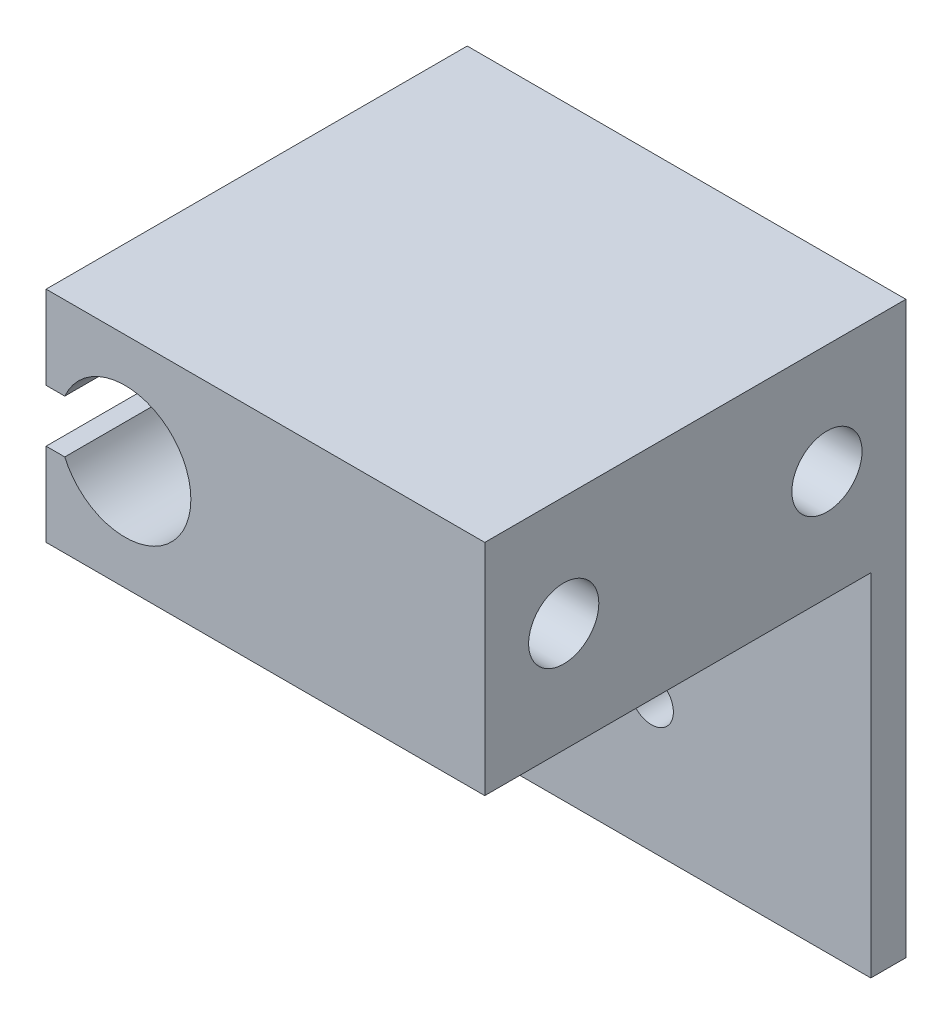
ISO-10303-21;
HEADER;
FILE_DESCRIPTION(('STEP AP214'),'2;1');
FILE_NAME('part.step','',(''),(''),'','','');
FILE_SCHEMA(('AUTOMOTIVE_DESIGN { 1 0 10303 214 1 1 1 1 }'));
ENDSEC;
DATA;
#1=APPLICATION_CONTEXT('core data for automotive mechanical design processes');
#2=APPLICATION_PROTOCOL_DEFINITION('international standard','automotive_design',2000,#1);
#3=PRODUCT_CONTEXT('',#1,'mechanical');
#4=PRODUCT('Part','Part','',(#3));
#5=PRODUCT_RELATED_PRODUCT_CATEGORY('part','',(#4));
#6=PRODUCT_DEFINITION_FORMATION('','',#4);
#7=PRODUCT_DEFINITION_CONTEXT('part definition',#1,'design');
#8=PRODUCT_DEFINITION('design','',#6,#7);
#9=PRODUCT_DEFINITION_SHAPE('','',#8);
#10=(LENGTH_UNIT() NAMED_UNIT(*) SI_UNIT(.MILLI.,.METRE.));
#11=(NAMED_UNIT(*) PLANE_ANGLE_UNIT() SI_UNIT($,.RADIAN.));
#12=(NAMED_UNIT(*) SI_UNIT($,.STERADIAN.) SOLID_ANGLE_UNIT());
#13=UNCERTAINTY_MEASURE_WITH_UNIT(LENGTH_MEASURE(1.E-05),#10,'distance_accuracy_value','');
#14=(GEOMETRIC_REPRESENTATION_CONTEXT(3) GLOBAL_UNCERTAINTY_ASSIGNED_CONTEXT((#13)) GLOBAL_UNIT_ASSIGNED_CONTEXT((#10,
#11,#12)) REPRESENTATION_CONTEXT('',''));
#15=CARTESIAN_POINT('',(0.,0.,0.));
#16=DIRECTION('',(0.,0.,1.));
#17=DIRECTION('',(1.,0.,0.));
#18=AXIS2_PLACEMENT_3D('',#15,#16,#17);
#19=CARTESIAN_POINT('',(25.,-12.5,24.));
#20=DIRECTION('',(-1.,0.,0.));
#21=DIRECTION('',(0.,0.,1.));
#22=AXIS2_PLACEMENT_3D('',#19,#20,#21);
#23=PLANE('',#22);
#24=CARTESIAN_POINT('',(25.,0.,15.));
#25=DIRECTION('',(1.,0.,0.));
#26=DIRECTION('',(0.,0.,-1.));
#27=AXIS2_PLACEMENT_3D('',#24,#25,#26);
#28=CIRCLE('',#27,4.);
#29=CARTESIAN_POINT('',(25.,0.,11.));
#30=VERTEX_POINT('',#29);
#31=EDGE_CURVE('E190',#30,#30,#28,.T.);
#32=ORIENTED_EDGE('',*,*,#31,.F.);
#33=EDGE_LOOP('',(#32));
#34=FACE_BOUND('',#33,.T.);
#35=CARTESIAN_POINT('',(25.,0.,-15.));
#36=DIRECTION('',(1.,0.,0.));
#37=DIRECTION('',(0.,0.,-1.));
#38=AXIS2_PLACEMENT_3D('',#35,#36,#37);
#39=CIRCLE('',#38,4.);
#40=CARTESIAN_POINT('',(25.,0.,-19.));
#41=VERTEX_POINT('',#40);
#42=EDGE_CURVE('E183',#41,#41,#39,.T.);
#43=ORIENTED_EDGE('',*,*,#42,.F.);
#44=EDGE_LOOP('',(#43));
#45=FACE_BOUND('',#44,.T.);
#46=DIRECTION('',(0.,1.,0.));
#47=VECTOR('',#46,1.);
#48=CARTESIAN_POINT('',(25.,-12.5,-24.));
#49=LINE('',#48,#47);
#50=CARTESIAN_POINT('',(25.,-52.5,-24.));
#51=VERTEX_POINT('',#50);
#52=CARTESIAN_POINT('',(25.,12.5,-24.));
#53=VERTEX_POINT('',#52);
#54=EDGE_CURVE('E133',#51,#53,#49,.T.);
#55=ORIENTED_EDGE('',*,*,#54,.T.);
#56=DIRECTION('',(0.,0.,-1.));
#57=VECTOR('',#56,1.);
#58=CARTESIAN_POINT('',(25.,12.5,24.));
#59=LINE('',#58,#57);
#60=CARTESIAN_POINT('',(25.,12.5,24.));
#61=VERTEX_POINT('',#60);
#62=EDGE_CURVE('E11',#61,#53,#59,.T.);
#63=ORIENTED_EDGE('',*,*,#62,.F.);
#64=DIRECTION('',(0.,1.,0.));
#65=VECTOR('',#64,1.);
#66=CARTESIAN_POINT('',(25.,-12.5,24.));
#67=LINE('',#66,#65);
#68=CARTESIAN_POINT('',(25.,-12.5,24.));
#69=VERTEX_POINT('',#68);
#70=EDGE_CURVE('E148',#69,#61,#67,.T.);
#71=ORIENTED_EDGE('',*,*,#70,.F.);
#72=DIRECTION('',(0.,0.,-1.));
#73=VECTOR('',#72,1.);
#74=CARTESIAN_POINT('',(25.,-12.5,24.));
#75=LINE('',#74,#73);
#76=CARTESIAN_POINT('',(25.,-12.5,-20.));
#77=VERTEX_POINT('',#76);
#78=EDGE_CURVE('E129',#69,#77,#75,.T.);
#79=ORIENTED_EDGE('',*,*,#78,.T.);
#80=DIRECTION('',(0.,-1.,0.));
#81=VECTOR('',#80,1.);
#82=CARTESIAN_POINT('',(25.,-12.5,-20.));
#83=LINE('',#82,#81);
#84=CARTESIAN_POINT('',(25.,-52.5,-20.));
#85=VERTEX_POINT('',#84);
#86=EDGE_CURVE('E47',#77,#85,#83,.T.);
#87=ORIENTED_EDGE('',*,*,#86,.T.);
#88=DIRECTION('',(0.,0.,-1.));
#89=VECTOR('',#88,1.);
#90=CARTESIAN_POINT('',(25.,-52.5,-20.));
#91=LINE('',#90,#89);
#92=EDGE_CURVE('E195',#85,#51,#91,.T.);
#93=ORIENTED_EDGE('',*,*,#92,.T.);
#94=EDGE_LOOP('',(#55,#63,#71,#79,#87,#93));
#95=FACE_BOUND('',#94,.T.);
#96=ADVANCED_FACE('F33',(#34,#45,#95),#23,.F.);
#97=CARTESIAN_POINT('',(-25.,12.5,24.));
#98=DIRECTION('',(0.,-1.,0.));
#99=DIRECTION('',(1.,0.,0.));
#100=AXIS2_PLACEMENT_3D('',#97,#98,#99);
#101=PLANE('',#100);
#102=DIRECTION('',(-1.,0.,0.));
#103=VECTOR('',#102,1.);
#104=CARTESIAN_POINT('',(-25.,12.5,-24.));
#105=LINE('',#104,#103);
#106=CARTESIAN_POINT('',(-25.,12.5,-24.));
#107=VERTEX_POINT('',#106);
#108=EDGE_CURVE('E136',#53,#107,#105,.T.);
#109=ORIENTED_EDGE('',*,*,#108,.T.);
#110=DIRECTION('',(0.,0.,-1.));
#111=VECTOR('',#110,1.);
#112=CARTESIAN_POINT('',(-25.,12.5,24.));
#113=LINE('',#112,#111);
#114=CARTESIAN_POINT('',(-25.,12.5,24.));
#115=VERTEX_POINT('',#114);
#116=EDGE_CURVE('E40',#115,#107,#113,.T.);
#117=ORIENTED_EDGE('',*,*,#116,.F.);
#118=DIRECTION('',(-1.,0.,0.));
#119=VECTOR('',#118,1.);
#120=CARTESIAN_POINT('',(-25.,12.5,24.));
#121=LINE('',#120,#119);
#122=EDGE_CURVE('E92',#61,#115,#121,.T.);
#123=ORIENTED_EDGE('',*,*,#122,.F.);
#124=ORIENTED_EDGE('',*,*,#62,.T.);
#125=EDGE_LOOP('',(#109,#117,#123,#124));
#126=FACE_BOUND('',#125,.T.);
#127=ADVANCED_FACE('F239',(#126),#101,.F.);
#128=CARTESIAN_POINT('',(-25.,3.,24.));
#129=DIRECTION('',(1.,0.,0.));
#130=DIRECTION('',(0.,0.,-1.));
#131=AXIS2_PLACEMENT_3D('',#128,#129,#130);
#132=PLANE('',#131);
#133=DIRECTION('',(0.,-1.,0.));
#134=VECTOR('',#133,1.);
#135=CARTESIAN_POINT('',(-25.,3.,-24.));
#136=LINE('',#135,#134);
#137=CARTESIAN_POINT('',(-25.,3.,-24.));
#138=VERTEX_POINT('',#137);
#139=EDGE_CURVE('E139',#107,#138,#136,.T.);
#140=ORIENTED_EDGE('',*,*,#139,.T.);
#141=DIRECTION('',(0.,0.,-1.));
#142=VECTOR('',#141,1.);
#143=CARTESIAN_POINT('',(-25.,3.,24.));
#144=LINE('',#143,#142);
#145=CARTESIAN_POINT('',(-25.,3.,24.));
#146=VERTEX_POINT('',#145);
#147=EDGE_CURVE('E156',#146,#138,#144,.T.);
#148=ORIENTED_EDGE('',*,*,#147,.F.);
#149=DIRECTION('',(0.,-1.,0.));
#150=VECTOR('',#149,1.);
#151=CARTESIAN_POINT('',(-25.,3.,24.));
#152=LINE('',#151,#150);
#153=EDGE_CURVE('E164',#115,#146,#152,.T.);
#154=ORIENTED_EDGE('',*,*,#153,.F.);
#155=ORIENTED_EDGE('',*,*,#116,.T.);
#156=EDGE_LOOP('',(#140,#148,#154,#155));
#157=FACE_BOUND('',#156,.T.);
#158=ADVANCED_FACE('F162',(#157),#132,.F.);
#159=CARTESIAN_POINT('',(-22.8738635424338,3.,24.));
#160=DIRECTION('',(0.,1.,0.));
#161=DIRECTION('',(0.,0.,1.));
#162=AXIS2_PLACEMENT_3D('',#159,#160,#161);
#163=PLANE('',#162);
#164=DIRECTION('',(1.,0.,0.));
#165=VECTOR('',#164,1.);
#166=CARTESIAN_POINT('',(-22.8738635424338,3.,-24.));
#167=LINE('',#166,#165);
#168=CARTESIAN_POINT('',(-22.8738635424338,3.,-24.));
#169=VERTEX_POINT('',#168);
#170=EDGE_CURVE('E141',#138,#169,#167,.T.);
#171=ORIENTED_EDGE('',*,*,#170,.T.);
#172=DIRECTION('',(0.,0.,-1.));
#173=VECTOR('',#172,1.);
#174=CARTESIAN_POINT('',(-22.8738635424338,3.,24.));
#175=LINE('',#174,#173);
#176=CARTESIAN_POINT('',(-22.8738635424338,3.,24.));
#177=VERTEX_POINT('',#176);
#178=EDGE_CURVE('E153',#177,#169,#175,.T.);
#179=ORIENTED_EDGE('',*,*,#178,.F.);
#180=DIRECTION('',(1.,0.,0.));
#181=VECTOR('',#180,1.);
#182=CARTESIAN_POINT('',(-22.8738635424338,3.,24.));
#183=LINE('',#182,#181);
#184=EDGE_CURVE('E177',#146,#177,#183,.T.);
#185=ORIENTED_EDGE('',*,*,#184,.F.);
#186=ORIENTED_EDGE('',*,*,#147,.T.);
#187=EDGE_LOOP('',(#171,#179,#185,#186));
#188=FACE_BOUND('',#187,.T.);
#189=ADVANCED_FACE('F173',(#188),#163,.F.);
#190=CARTESIAN_POINT('',(-16.,0.,24.));
#191=DIRECTION('',(0.,0.,-1.));
#192=DIRECTION('',(-1.,0.,0.));
#193=AXIS2_PLACEMENT_3D('',#190,#191,#192);
#194=CYLINDRICAL_SURFACE('',#193,7.5);
#195=CARTESIAN_POINT('',(-16.,0.,-24.));
#196=DIRECTION('',(0.,0.,-1.));
#197=DIRECTION('',(1.,0.,0.));
#198=AXIS2_PLACEMENT_3D('',#195,#196,#197);
#199=CIRCLE('',#198,7.5);
#200=CARTESIAN_POINT('',(-22.8738635424338,-3.,-24.));
#201=VERTEX_POINT('',#200);
#202=EDGE_CURVE('E143',#169,#201,#199,.T.);
#203=ORIENTED_EDGE('',*,*,#202,.T.);
#204=DIRECTION('',(0.,0.,-1.));
#205=VECTOR('',#204,1.);
#206=CARTESIAN_POINT('',(-22.8738635424338,-3.,24.));
#207=LINE('',#206,#205);
#208=CARTESIAN_POINT('',(-22.8738635424338,-3.,24.));
#209=VERTEX_POINT('',#208);
#210=EDGE_CURVE('E122',#209,#201,#207,.T.);
#211=ORIENTED_EDGE('',*,*,#210,.F.);
#212=CARTESIAN_POINT('',(-16.,0.,24.));
#213=DIRECTION('',(0.,0.,-1.));
#214=DIRECTION('',(1.,0.,0.));
#215=AXIS2_PLACEMENT_3D('',#212,#213,#214);
#216=CIRCLE('',#215,7.5);
#217=EDGE_CURVE('E114',#177,#209,#216,.T.);
#218=ORIENTED_EDGE('',*,*,#217,.F.);
#219=ORIENTED_EDGE('',*,*,#178,.T.);
#220=EDGE_LOOP('',(#203,#211,#218,#219));
#221=FACE_BOUND('',#220,.T.);
#222=ADVANCED_FACE('F176',(#221),#194,.F.);
#223=CARTESIAN_POINT('',(-25.,-3.,24.));
#224=DIRECTION('',(0.,-1.,0.));
#225=DIRECTION('',(0.,0.,-1.));
#226=AXIS2_PLACEMENT_3D('',#223,#224,#225);
#227=PLANE('',#226);
#228=DIRECTION('',(-1.,0.,0.));
#229=VECTOR('',#228,1.);
#230=CARTESIAN_POINT('',(-25.,-3.,-24.));
#231=LINE('',#230,#229);
#232=CARTESIAN_POINT('',(-25.,-3.,-24.));
#233=VERTEX_POINT('',#232);
#234=EDGE_CURVE('E84',#201,#233,#231,.T.);
#235=ORIENTED_EDGE('',*,*,#234,.T.);
#236=DIRECTION('',(0.,0.,-1.));
#237=VECTOR('',#236,1.);
#238=CARTESIAN_POINT('',(-25.,-3.,24.));
#239=LINE('',#238,#237);
#240=CARTESIAN_POINT('',(-25.,-3.,24.));
#241=VERTEX_POINT('',#240);
#242=EDGE_CURVE('E117',#241,#233,#239,.T.);
#243=ORIENTED_EDGE('',*,*,#242,.F.);
#244=DIRECTION('',(-1.,0.,0.));
#245=VECTOR('',#244,1.);
#246=CARTESIAN_POINT('',(-25.,-3.,24.));
#247=LINE('',#246,#245);
#248=EDGE_CURVE('E108',#209,#241,#247,.T.);
#249=ORIENTED_EDGE('',*,*,#248,.F.);
#250=ORIENTED_EDGE('',*,*,#210,.T.);
#251=EDGE_LOOP('',(#235,#243,#249,#250));
#252=FACE_BOUND('',#251,.T.);
#253=ADVANCED_FACE('F118',(#252),#227,.F.);
#254=CARTESIAN_POINT('',(-25.,-12.5,24.));
#255=DIRECTION('',(1.,0.,0.));
#256=DIRECTION('',(0.,0.,-1.));
#257=AXIS2_PLACEMENT_3D('',#254,#255,#256);
#258=PLANE('',#257);
#259=DIRECTION('',(0.,-1.,0.));
#260=VECTOR('',#259,1.);
#261=CARTESIAN_POINT('',(-25.,-12.5,-24.));
#262=LINE('',#261,#260);
#263=CARTESIAN_POINT('',(-25.,-52.5,-24.));
#264=VERTEX_POINT('',#263);
#265=EDGE_CURVE('E146',#233,#264,#262,.T.);
#266=ORIENTED_EDGE('',*,*,#265,.T.);
#267=DIRECTION('',(0.,0.,-1.));
#268=VECTOR('',#267,1.);
#269=CARTESIAN_POINT('',(-25.,-52.5,-20.));
#270=LINE('',#269,#268);
#271=CARTESIAN_POINT('',(-25.,-52.5,-20.));
#272=VERTEX_POINT('',#271);
#273=EDGE_CURVE('E187',#272,#264,#270,.T.);
#274=ORIENTED_EDGE('',*,*,#273,.F.);
#275=DIRECTION('',(0.,1.,0.));
#276=VECTOR('',#275,1.);
#277=CARTESIAN_POINT('',(-25.,-12.5,-20.));
#278=LINE('',#277,#276);
#279=CARTESIAN_POINT('',(-25.,-12.5,-20.));
#280=VERTEX_POINT('',#279);
#281=EDGE_CURVE('E206',#272,#280,#278,.T.);
#282=ORIENTED_EDGE('',*,*,#281,.T.);
#283=DIRECTION('',(0.,0.,-1.));
#284=VECTOR('',#283,1.);
#285=CARTESIAN_POINT('',(-25.,-12.5,24.));
#286=LINE('',#285,#284);
#287=CARTESIAN_POINT('',(-25.,-12.5,24.));
#288=VERTEX_POINT('',#287);
#289=EDGE_CURVE('E123',#288,#280,#286,.T.);
#290=ORIENTED_EDGE('',*,*,#289,.F.);
#291=DIRECTION('',(0.,-1.,0.));
#292=VECTOR('',#291,1.);
#293=CARTESIAN_POINT('',(-25.,-12.5,24.));
#294=LINE('',#293,#292);
#295=EDGE_CURVE('E111',#241,#288,#294,.T.);
#296=ORIENTED_EDGE('',*,*,#295,.F.);
#297=ORIENTED_EDGE('',*,*,#242,.T.);
#298=EDGE_LOOP('',(#266,#274,#282,#290,#296,#297));
#299=FACE_BOUND('',#298,.T.);
#300=ADVANCED_FACE('F125',(#299),#258,.F.);
#301=CARTESIAN_POINT('',(-25.,-12.5,24.));
#302=DIRECTION('',(0.,1.,0.));
#303=DIRECTION('',(0.,0.,1.));
#304=AXIS2_PLACEMENT_3D('',#301,#302,#303);
#305=PLANE('',#304);
#306=ORIENTED_EDGE('',*,*,#289,.T.);
#307=DIRECTION('',(1.,0.,0.));
#308=VECTOR('',#307,1.);
#309=CARTESIAN_POINT('',(25.,-12.5,-20.));
#310=LINE('',#309,#308);
#311=EDGE_CURVE('E198',#280,#77,#310,.T.);
#312=ORIENTED_EDGE('',*,*,#311,.T.);
#313=ORIENTED_EDGE('',*,*,#78,.F.);
#314=DIRECTION('',(1.,0.,0.));
#315=VECTOR('',#314,1.);
#316=CARTESIAN_POINT('',(-25.,-12.5,24.));
#317=LINE('',#316,#315);
#318=EDGE_CURVE('E56',#288,#69,#317,.T.);
#319=ORIENTED_EDGE('',*,*,#318,.F.);
#320=EDGE_LOOP('',(#306,#312,#313,#319));
#321=FACE_BOUND('',#320,.T.);
#322=ADVANCED_FACE('F235',(#321),#305,.F.);
#323=CARTESIAN_POINT('',(-16.,0.,24.));
#324=DIRECTION('',(0.,0.,1.));
#325=DIRECTION('',(1.,0.,0.));
#326=AXIS2_PLACEMENT_3D('',#323,#324,#325);
#327=PLANE('',#326);
#328=ORIENTED_EDGE('',*,*,#70,.T.);
#329=ORIENTED_EDGE('',*,*,#122,.T.);
#330=ORIENTED_EDGE('',*,*,#153,.T.);
#331=ORIENTED_EDGE('',*,*,#184,.T.);
#332=ORIENTED_EDGE('',*,*,#217,.T.);
#333=ORIENTED_EDGE('',*,*,#248,.T.);
#334=ORIENTED_EDGE('',*,*,#295,.T.);
#335=ORIENTED_EDGE('',*,*,#318,.T.);
#336=EDGE_LOOP('',(#328,#329,#330,#331,#332,#333,#334,#335));
#337=FACE_BOUND('',#336,.T.);
#338=ADVANCED_FACE('F109',(#337),#327,.T.);
#339=CARTESIAN_POINT('',(-16.,0.,-24.));
#340=DIRECTION('',(0.,0.,1.));
#341=DIRECTION('',(1.,0.,0.));
#342=AXIS2_PLACEMENT_3D('',#339,#340,#341);
#343=PLANE('',#342);
#344=ORIENTED_EDGE('',*,*,#54,.F.);
#345=DIRECTION('',(-1.,0.,0.));
#346=VECTOR('',#345,1.);
#347=CARTESIAN_POINT('',(25.,-52.5,-24.));
#348=LINE('',#347,#346);
#349=EDGE_CURVE('E201',#51,#264,#348,.T.);
#350=ORIENTED_EDGE('',*,*,#349,.T.);
#351=ORIENTED_EDGE('',*,*,#265,.F.);
#352=ORIENTED_EDGE('',*,*,#234,.F.);
#353=ORIENTED_EDGE('',*,*,#202,.F.);
#354=ORIENTED_EDGE('',*,*,#170,.F.);
#355=ORIENTED_EDGE('',*,*,#139,.F.);
#356=ORIENTED_EDGE('',*,*,#108,.F.);
#357=EDGE_LOOP('',(#344,#350,#351,#352,#353,#354,#355,#356));
#358=FACE_BOUND('',#357,.T.);
#359=CARTESIAN_POINT('',(0.,-37.5,-24.));
#360=DIRECTION('',(0.,0.,-1.));
#361=DIRECTION('',(-1.,0.,0.));
#362=AXIS2_PLACEMENT_3D('',#359,#360,#361);
#363=CIRCLE('',#362,2.5);
#364=CARTESIAN_POINT('',(-2.5,-37.5,-24.));
#365=VERTEX_POINT('',#364);
#366=EDGE_CURVE('E212',#365,#365,#363,.T.);
#367=ORIENTED_EDGE('',*,*,#366,.F.);
#368=EDGE_LOOP('',(#367));
#369=FACE_BOUND('',#368,.T.);
#370=ADVANCED_FACE('F168',(#358,#369),#343,.F.);
#371=CARTESIAN_POINT('',(-5.,0.,-15.));
#372=DIRECTION('',(1.,0.,0.));
#373=DIRECTION('',(0.,0.,-1.));
#374=AXIS2_PLACEMENT_3D('',#371,#372,#373);
#375=CYLINDRICAL_SURFACE('',#374,4.);
#376=CARTESIAN_POINT('',(-5.,0.,-15.));
#377=DIRECTION('',(1.,0.,0.));
#378=DIRECTION('',(0.,0.,-1.));
#379=AXIS2_PLACEMENT_3D('',#376,#377,#378);
#380=CIRCLE('',#379,4.);
#381=CARTESIAN_POINT('',(-5.,0.,-19.));
#382=VERTEX_POINT('',#381);
#383=EDGE_CURVE('E186',#382,#382,#380,.T.);
#384=ORIENTED_EDGE('',*,*,#383,.F.);
#385=EDGE_LOOP('',(#384));
#386=FACE_BOUND('',#385,.T.);
#387=ORIENTED_EDGE('',*,*,#42,.T.);
#388=EDGE_LOOP('',(#387));
#389=FACE_BOUND('',#388,.T.);
#390=ADVANCED_FACE('F226',(#386,#389),#375,.F.);
#391=CARTESIAN_POINT('',(-5.,0.,-15.));
#392=DIRECTION('',(1.,0.,0.));
#393=DIRECTION('',(0.,0.,-1.));
#394=AXIS2_PLACEMENT_3D('',#391,#392,#393);
#395=PLANE('',#394);
#396=ORIENTED_EDGE('',*,*,#383,.T.);
#397=EDGE_LOOP('',(#396));
#398=FACE_BOUND('',#397,.T.);
#399=ADVANCED_FACE('F232',(#398),#395,.T.);
#400=CARTESIAN_POINT('',(-5.,0.,15.));
#401=DIRECTION('',(1.,0.,0.));
#402=DIRECTION('',(0.,0.,-1.));
#403=AXIS2_PLACEMENT_3D('',#400,#401,#402);
#404=CYLINDRICAL_SURFACE('',#403,4.);
#405=CARTESIAN_POINT('',(-5.,0.,15.));
#406=DIRECTION('',(1.,0.,0.));
#407=DIRECTION('',(0.,0.,-1.));
#408=AXIS2_PLACEMENT_3D('',#405,#406,#407);
#409=CIRCLE('',#408,4.);
#410=CARTESIAN_POINT('',(-5.,0.,11.));
#411=VERTEX_POINT('',#410);
#412=EDGE_CURVE('E137',#411,#411,#409,.T.);
#413=ORIENTED_EDGE('',*,*,#412,.F.);
#414=EDGE_LOOP('',(#413));
#415=FACE_BOUND('',#414,.T.);
#416=ORIENTED_EDGE('',*,*,#31,.T.);
#417=EDGE_LOOP('',(#416));
#418=FACE_BOUND('',#417,.T.);
#419=ADVANCED_FACE('F341',(#415,#418),#404,.F.);
#420=CARTESIAN_POINT('',(-5.,0.,15.));
#421=DIRECTION('',(1.,0.,0.));
#422=DIRECTION('',(0.,0.,-1.));
#423=AXIS2_PLACEMENT_3D('',#420,#421,#422);
#424=PLANE('',#423);
#425=ORIENTED_EDGE('',*,*,#412,.T.);
#426=EDGE_LOOP('',(#425));
#427=FACE_BOUND('',#426,.T.);
#428=ADVANCED_FACE('F320',(#427),#424,.T.);
#429=CARTESIAN_POINT('',(25.,-52.5,-20.));
#430=DIRECTION('',(0.,-1.,0.));
#431=DIRECTION('',(0.,0.,-1.));
#432=AXIS2_PLACEMENT_3D('',#429,#430,#431);
#433=PLANE('',#432);
#434=ORIENTED_EDGE('',*,*,#349,.F.);
#435=ORIENTED_EDGE('',*,*,#92,.F.);
#436=DIRECTION('',(-1.,0.,0.));
#437=VECTOR('',#436,1.);
#438=CARTESIAN_POINT('',(25.,-52.5,-20.));
#439=LINE('',#438,#437);
#440=EDGE_CURVE('E208',#85,#272,#439,.T.);
#441=ORIENTED_EDGE('',*,*,#440,.T.);
#442=ORIENTED_EDGE('',*,*,#273,.T.);
#443=EDGE_LOOP('',(#434,#435,#441,#442));
#444=FACE_BOUND('',#443,.T.);
#445=ADVANCED_FACE('F260',(#444),#433,.T.);
#446=CARTESIAN_POINT('',(0.,0.,-20.));
#447=DIRECTION('',(0.,0.,-1.));
#448=DIRECTION('',(-1.,0.,0.));
#449=AXIS2_PLACEMENT_3D('',#446,#447,#448);
#450=PLANE('',#449);
#451=CARTESIAN_POINT('',(0.,-37.5,-20.));
#452=DIRECTION('',(0.,0.,-1.));
#453=DIRECTION('',(-1.,0.,0.));
#454=AXIS2_PLACEMENT_3D('',#451,#452,#453);
#455=CIRCLE('',#454,2.5);
#456=CARTESIAN_POINT('',(-2.5,-37.5,-20.));
#457=VERTEX_POINT('',#456);
#458=EDGE_CURVE('E204',#457,#457,#455,.T.);
#459=ORIENTED_EDGE('',*,*,#458,.T.);
#460=EDGE_LOOP('',(#459));
#461=FACE_BOUND('',#460,.T.);
#462=ORIENTED_EDGE('',*,*,#86,.F.);
#463=ORIENTED_EDGE('',*,*,#311,.F.);
#464=ORIENTED_EDGE('',*,*,#281,.F.);
#465=ORIENTED_EDGE('',*,*,#440,.F.);
#466=EDGE_LOOP('',(#462,#463,#464,#465));
#467=FACE_BOUND('',#466,.T.);
#468=ADVANCED_FACE('F218',(#461,#467),#450,.F.);
#469=CARTESIAN_POINT('',(0.,-37.5,-20.));
#470=DIRECTION('',(0.,0.,-1.));
#471=DIRECTION('',(-1.,0.,0.));
#472=AXIS2_PLACEMENT_3D('',#469,#470,#471);
#473=CYLINDRICAL_SURFACE('',#472,2.5);
#474=ORIENTED_EDGE('',*,*,#458,.F.);
#475=EDGE_LOOP('',(#474));
#476=FACE_BOUND('',#475,.T.);
#477=ORIENTED_EDGE('',*,*,#366,.T.);
#478=EDGE_LOOP('',(#477));
#479=FACE_BOUND('',#478,.T.);
#480=ADVANCED_FACE('F220',(#476,#479),#473,.F.);
#481=CLOSED_SHELL('',(#96,#127,#158,#189,#222,#253,#300,#322,#338,#370,#390,#399,#419,#428,#445,
#468,#480));
#482=MANIFOLD_SOLID_BREP('B2',#481);
#483=ADVANCED_BREP_SHAPE_REPRESENTATION('',(#18,#482),#14);
#484=SHAPE_DEFINITION_REPRESENTATION(#9,#483);
ENDSEC;
END-ISO-10303-21;
